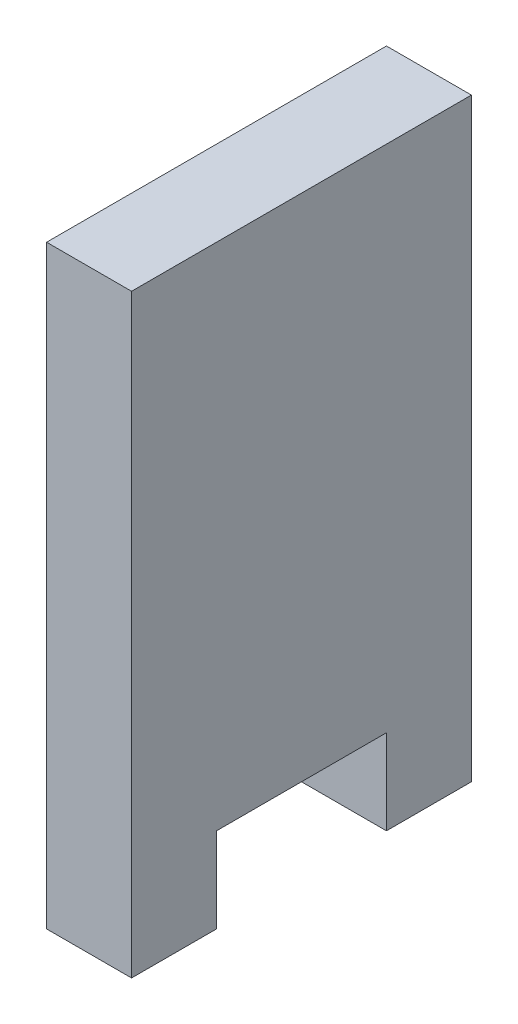
ISO-10303-21;
HEADER;
FILE_DESCRIPTION(('STEP AP214'),'2;1');
FILE_NAME('part.step','',(''),(''),'','','');
FILE_SCHEMA(('AUTOMOTIVE_DESIGN { 1 0 10303 214 1 1 1 1 }'));
ENDSEC;
DATA;
#1=APPLICATION_CONTEXT('core data for automotive mechanical design processes');
#2=APPLICATION_PROTOCOL_DEFINITION('international standard','automotive_design',2000,#1);
#3=PRODUCT_CONTEXT('',#1,'mechanical');
#4=PRODUCT('Part','Part','',(#3));
#5=PRODUCT_RELATED_PRODUCT_CATEGORY('part','',(#4));
#6=PRODUCT_DEFINITION_FORMATION('','',#4);
#7=PRODUCT_DEFINITION_CONTEXT('part definition',#1,'design');
#8=PRODUCT_DEFINITION('design','',#6,#7);
#9=PRODUCT_DEFINITION_SHAPE('','',#8);
#10=(LENGTH_UNIT() NAMED_UNIT(*) SI_UNIT(.MILLI.,.METRE.));
#11=(NAMED_UNIT(*) PLANE_ANGLE_UNIT() SI_UNIT($,.RADIAN.));
#12=(NAMED_UNIT(*) SI_UNIT($,.STERADIAN.) SOLID_ANGLE_UNIT());
#13=UNCERTAINTY_MEASURE_WITH_UNIT(LENGTH_MEASURE(1.E-05),#10,'distance_accuracy_value','');
#14=(GEOMETRIC_REPRESENTATION_CONTEXT(3) GLOBAL_UNCERTAINTY_ASSIGNED_CONTEXT((#13)) GLOBAL_UNIT_ASSIGNED_CONTEXT((#10,
#11,#12)) REPRESENTATION_CONTEXT('',''));
#15=CARTESIAN_POINT('',(0.,0.,0.));
#16=DIRECTION('',(0.,0.,1.));
#17=DIRECTION('',(1.,0.,0.));
#18=AXIS2_PLACEMENT_3D('',#15,#16,#17);
#19=CARTESIAN_POINT('',(6.35,-19.05,0.));
#20=DIRECTION('',(0.,1.,0.));
#21=DIRECTION('',(0.,0.,1.));
#22=AXIS2_PLACEMENT_3D('',#19,#20,#21);
#23=PLANE('',#22);
#24=DIRECTION('',(0.,0.,-1.));
#25=VECTOR('',#24,1.);
#26=CARTESIAN_POINT('',(0.,-19.05,0.));
#27=LINE('',#26,#25);
#28=CARTESIAN_POINT('',(0.,-19.05,6.35));
#29=VERTEX_POINT('',#28);
#30=CARTESIAN_POINT('',(0.,-19.05,-6.35));
#31=VERTEX_POINT('',#30);
#32=EDGE_CURVE('E133',#29,#31,#27,.T.);
#33=ORIENTED_EDGE('',*,*,#32,.T.);
#34=DIRECTION('',(-1.,0.,0.));
#35=VECTOR('',#34,1.);
#36=CARTESIAN_POINT('',(6.35,-19.05,-6.35));
#37=LINE('',#36,#35);
#38=CARTESIAN_POINT('',(6.35,-19.05,-6.35));
#39=VERTEX_POINT('',#38);
#40=EDGE_CURVE('E11',#39,#31,#37,.T.);
#41=ORIENTED_EDGE('',*,*,#40,.F.);
#42=DIRECTION('',(0.,0.,-1.));
#43=VECTOR('',#42,1.);
#44=CARTESIAN_POINT('',(6.35,-19.05,0.));
#45=LINE('',#44,#43);
#46=CARTESIAN_POINT('',(6.35,-19.05,6.35));
#47=VERTEX_POINT('',#46);
#48=EDGE_CURVE('E153',#47,#39,#45,.T.);
#49=ORIENTED_EDGE('',*,*,#48,.F.);
#50=DIRECTION('',(-1.,0.,0.));
#51=VECTOR('',#50,1.);
#52=CARTESIAN_POINT('',(6.35,-19.05,6.35));
#53=LINE('',#52,#51);
#54=EDGE_CURVE('E51',#47,#29,#53,.T.);
#55=ORIENTED_EDGE('',*,*,#54,.T.);
#56=EDGE_LOOP('',(#33,#41,#49,#55));
#57=FACE_BOUND('',#56,.T.);
#58=ADVANCED_FACE('F35',(#57),#23,.F.);
#59=CARTESIAN_POINT('',(6.35,0.,-6.35));
#60=DIRECTION('',(0.,0.,-1.));
#61=DIRECTION('',(0.,1.,0.));
#62=AXIS2_PLACEMENT_3D('',#59,#60,#61);
#63=PLANE('',#62);
#64=DIRECTION('',(0.,-1.,0.));
#65=VECTOR('',#64,1.);
#66=CARTESIAN_POINT('',(0.,0.,-6.35));
#67=LINE('',#66,#65);
#68=CARTESIAN_POINT('',(0.,-25.4,-6.35));
#69=VERTEX_POINT('',#68);
#70=EDGE_CURVE('E135',#31,#69,#67,.T.);
#71=ORIENTED_EDGE('',*,*,#70,.T.);
#72=DIRECTION('',(-1.,0.,0.));
#73=VECTOR('',#72,1.);
#74=CARTESIAN_POINT('',(6.35,-25.4,-6.35));
#75=LINE('',#74,#73);
#76=CARTESIAN_POINT('',(6.35,-25.4,-6.35));
#77=VERTEX_POINT('',#76);
#78=EDGE_CURVE('E43',#77,#69,#75,.T.);
#79=ORIENTED_EDGE('',*,*,#78,.F.);
#80=DIRECTION('',(0.,-1.,0.));
#81=VECTOR('',#80,1.);
#82=CARTESIAN_POINT('',(6.35,0.,-6.35));
#83=LINE('',#82,#81);
#84=EDGE_CURVE('E90',#39,#77,#83,.T.);
#85=ORIENTED_EDGE('',*,*,#84,.F.);
#86=ORIENTED_EDGE('',*,*,#40,.T.);
#87=EDGE_LOOP('',(#71,#79,#85,#86));
#88=FACE_BOUND('',#87,.T.);
#89=ADVANCED_FACE('F166',(#88),#63,.F.);
#90=CARTESIAN_POINT('',(6.35,-25.4,0.));
#91=DIRECTION('',(0.,-1.,0.));
#92=DIRECTION('',(0.,0.,-1.));
#93=AXIS2_PLACEMENT_3D('',#90,#91,#92);
#94=PLANE('',#93);
#95=DIRECTION('',(0.,0.,1.));
#96=VECTOR('',#95,1.);
#97=CARTESIAN_POINT('',(0.,-25.4,0.));
#98=LINE('',#97,#96);
#99=CARTESIAN_POINT('',(0.,-25.4,-12.7));
#100=VERTEX_POINT('',#99);
#101=EDGE_CURVE('E138',#100,#69,#98,.T.);
#102=ORIENTED_EDGE('',*,*,#101,.F.);
#103=DIRECTION('',(-1.,0.,0.));
#104=VECTOR('',#103,1.);
#105=CARTESIAN_POINT('',(6.35,-25.4,-12.7));
#106=LINE('',#105,#104);
#107=CARTESIAN_POINT('',(6.35,-25.4,-12.7));
#108=VERTEX_POINT('',#107);
#109=EDGE_CURVE('E159',#108,#100,#106,.T.);
#110=ORIENTED_EDGE('',*,*,#109,.F.);
#111=DIRECTION('',(0.,0.,1.));
#112=VECTOR('',#111,1.);
#113=CARTESIAN_POINT('',(6.35,-25.4,0.));
#114=LINE('',#113,#112);
#115=EDGE_CURVE('E165',#108,#77,#114,.T.);
#116=ORIENTED_EDGE('',*,*,#115,.T.);
#117=ORIENTED_EDGE('',*,*,#78,.T.);
#118=EDGE_LOOP('',(#102,#110,#116,#117));
#119=FACE_BOUND('',#118,.T.);
#120=ADVANCED_FACE('F163',(#119),#94,.T.);
#121=CARTESIAN_POINT('',(6.35,0.,-12.7));
#122=DIRECTION('',(0.,0.,1.));
#123=DIRECTION('',(0.,-1.,0.));
#124=AXIS2_PLACEMENT_3D('',#121,#122,#123);
#125=PLANE('',#124);
#126=DIRECTION('',(0.,1.,0.));
#127=VECTOR('',#126,1.);
#128=CARTESIAN_POINT('',(0.,0.,-12.7));
#129=LINE('',#128,#127);
#130=CARTESIAN_POINT('',(0.,19.05,-12.7));
#131=VERTEX_POINT('',#130);
#132=EDGE_CURVE('E141',#100,#131,#129,.T.);
#133=ORIENTED_EDGE('',*,*,#132,.T.);
#134=DIRECTION('',(-1.,0.,0.));
#135=VECTOR('',#134,1.);
#136=CARTESIAN_POINT('',(6.35,19.05,-12.7));
#137=LINE('',#136,#135);
#138=CARTESIAN_POINT('',(6.35,19.05,-12.7));
#139=VERTEX_POINT('',#138);
#140=EDGE_CURVE('E157',#139,#131,#137,.T.);
#141=ORIENTED_EDGE('',*,*,#140,.F.);
#142=DIRECTION('',(0.,1.,0.));
#143=VECTOR('',#142,1.);
#144=CARTESIAN_POINT('',(6.35,0.,-12.7));
#145=LINE('',#144,#143);
#146=EDGE_CURVE('E128',#108,#139,#145,.T.);
#147=ORIENTED_EDGE('',*,*,#146,.F.);
#148=ORIENTED_EDGE('',*,*,#109,.T.);
#149=EDGE_LOOP('',(#133,#141,#147,#148));
#150=FACE_BOUND('',#149,.T.);
#151=ADVANCED_FACE('F174',(#150),#125,.F.);
#152=CARTESIAN_POINT('',(6.35,19.05,0.));
#153=DIRECTION('',(0.,1.,0.));
#154=DIRECTION('',(0.,0.,1.));
#155=AXIS2_PLACEMENT_3D('',#152,#153,#154);
#156=PLANE('',#155);
#157=DIRECTION('',(0.,0.,-1.));
#158=VECTOR('',#157,1.);
#159=CARTESIAN_POINT('',(0.,19.05,0.));
#160=LINE('',#159,#158);
#161=CARTESIAN_POINT('',(0.,19.05,12.7));
#162=VERTEX_POINT('',#161);
#163=EDGE_CURVE('E144',#162,#131,#160,.T.);
#164=ORIENTED_EDGE('',*,*,#163,.F.);
#165=DIRECTION('',(-1.,0.,0.));
#166=VECTOR('',#165,1.);
#167=CARTESIAN_POINT('',(6.35,19.05,12.7));
#168=LINE('',#167,#166);
#169=CARTESIAN_POINT('',(6.35,19.05,12.7));
#170=VERTEX_POINT('',#169);
#171=EDGE_CURVE('E115',#170,#162,#168,.T.);
#172=ORIENTED_EDGE('',*,*,#171,.F.);
#173=DIRECTION('',(0.,0.,-1.));
#174=VECTOR('',#173,1.);
#175=CARTESIAN_POINT('',(6.35,19.05,0.));
#176=LINE('',#175,#174);
#177=EDGE_CURVE('E126',#170,#139,#176,.T.);
#178=ORIENTED_EDGE('',*,*,#177,.T.);
#179=ORIENTED_EDGE('',*,*,#140,.T.);
#180=EDGE_LOOP('',(#164,#172,#178,#179));
#181=FACE_BOUND('',#180,.T.);
#182=ADVANCED_FACE('F200',(#181),#156,.T.);
#183=CARTESIAN_POINT('',(6.35,0.,12.7));
#184=DIRECTION('',(0.,0.,1.));
#185=DIRECTION('',(0.,-1.,0.));
#186=AXIS2_PLACEMENT_3D('',#183,#184,#185);
#187=PLANE('',#186);
#188=DIRECTION('',(0.,1.,0.));
#189=VECTOR('',#188,1.);
#190=CARTESIAN_POINT('',(0.,0.,12.7));
#191=LINE('',#190,#189);
#192=CARTESIAN_POINT('',(0.,-25.4,12.7));
#193=VERTEX_POINT('',#192);
#194=EDGE_CURVE('E112',#193,#162,#191,.T.);
#195=ORIENTED_EDGE('',*,*,#194,.F.);
#196=DIRECTION('',(-1.,0.,0.));
#197=VECTOR('',#196,1.);
#198=CARTESIAN_POINT('',(6.35,-25.4,12.7));
#199=LINE('',#198,#197);
#200=CARTESIAN_POINT('',(6.35,-25.4,12.7));
#201=VERTEX_POINT('',#200);
#202=EDGE_CURVE('E106',#201,#193,#199,.T.);
#203=ORIENTED_EDGE('',*,*,#202,.F.);
#204=DIRECTION('',(0.,1.,0.));
#205=VECTOR('',#204,1.);
#206=CARTESIAN_POINT('',(6.35,0.,12.7));
#207=LINE('',#206,#205);
#208=EDGE_CURVE('E110',#201,#170,#207,.T.);
#209=ORIENTED_EDGE('',*,*,#208,.T.);
#210=ORIENTED_EDGE('',*,*,#171,.T.);
#211=EDGE_LOOP('',(#195,#203,#209,#210));
#212=FACE_BOUND('',#211,.T.);
#213=ADVANCED_FACE('F108',(#212),#187,.T.);
#214=CARTESIAN_POINT('',(6.35,-25.4,0.));
#215=DIRECTION('',(0.,1.,0.));
#216=DIRECTION('',(0.,0.,1.));
#217=AXIS2_PLACEMENT_3D('',#214,#215,#216);
#218=PLANE('',#217);
#219=DIRECTION('',(0.,0.,-1.));
#220=VECTOR('',#219,1.);
#221=CARTESIAN_POINT('',(0.,-25.4,0.));
#222=LINE('',#221,#220);
#223=CARTESIAN_POINT('',(0.,-25.4,6.35));
#224=VERTEX_POINT('',#223);
#225=EDGE_CURVE('E148',#193,#224,#222,.T.);
#226=ORIENTED_EDGE('',*,*,#225,.T.);
#227=DIRECTION('',(-1.,0.,0.));
#228=VECTOR('',#227,1.);
#229=CARTESIAN_POINT('',(6.35,-25.4,6.35));
#230=LINE('',#229,#228);
#231=CARTESIAN_POINT('',(6.35,-25.4,6.35));
#232=VERTEX_POINT('',#231);
#233=EDGE_CURVE('E78',#232,#224,#230,.T.);
#234=ORIENTED_EDGE('',*,*,#233,.F.);
#235=DIRECTION('',(0.,0.,-1.));
#236=VECTOR('',#235,1.);
#237=CARTESIAN_POINT('',(6.35,-25.4,0.));
#238=LINE('',#237,#236);
#239=EDGE_CURVE('E117',#201,#232,#238,.T.);
#240=ORIENTED_EDGE('',*,*,#239,.F.);
#241=ORIENTED_EDGE('',*,*,#202,.T.);
#242=EDGE_LOOP('',(#226,#234,#240,#241));
#243=FACE_BOUND('',#242,.T.);
#244=ADVANCED_FACE('F118',(#243),#218,.F.);
#245=CARTESIAN_POINT('',(6.35,0.,6.35));
#246=DIRECTION('',(0.,0.,-1.));
#247=DIRECTION('',(-1.,0.,0.));
#248=AXIS2_PLACEMENT_3D('',#245,#246,#247);
#249=PLANE('',#248);
#250=DIRECTION('',(0.,-1.,0.));
#251=VECTOR('',#250,1.);
#252=CARTESIAN_POINT('',(0.,0.,6.35));
#253=LINE('',#252,#251);
#254=EDGE_CURVE('E150',#29,#224,#253,.T.);
#255=ORIENTED_EDGE('',*,*,#254,.F.);
#256=ORIENTED_EDGE('',*,*,#54,.F.);
#257=DIRECTION('',(0.,-1.,0.));
#258=VECTOR('',#257,1.);
#259=CARTESIAN_POINT('',(6.35,0.,6.35));
#260=LINE('',#259,#258);
#261=EDGE_CURVE('E121',#47,#232,#260,.T.);
#262=ORIENTED_EDGE('',*,*,#261,.T.);
#263=ORIENTED_EDGE('',*,*,#233,.T.);
#264=EDGE_LOOP('',(#255,#256,#262,#263));
#265=FACE_BOUND('',#264,.T.);
#266=ADVANCED_FACE('F179',(#265),#249,.T.);
#267=CARTESIAN_POINT('',(6.35,0.,0.));
#268=DIRECTION('',(1.,0.,0.));
#269=DIRECTION('',(0.,0.,-1.));
#270=AXIS2_PLACEMENT_3D('',#267,#268,#269);
#271=PLANE('',#270);
#272=ORIENTED_EDGE('',*,*,#48,.T.);
#273=ORIENTED_EDGE('',*,*,#84,.T.);
#274=ORIENTED_EDGE('',*,*,#115,.F.);
#275=ORIENTED_EDGE('',*,*,#146,.T.);
#276=ORIENTED_EDGE('',*,*,#177,.F.);
#277=ORIENTED_EDGE('',*,*,#208,.F.);
#278=ORIENTED_EDGE('',*,*,#239,.T.);
#279=ORIENTED_EDGE('',*,*,#261,.F.);
#280=EDGE_LOOP('',(#272,#273,#274,#275,#276,#277,#278,#279));
#281=FACE_BOUND('',#280,.T.);
#282=ADVANCED_FACE('F124',(#281),#271,.T.);
#283=CARTESIAN_POINT('',(0.,0.,0.));
#284=DIRECTION('',(1.,0.,0.));
#285=DIRECTION('',(0.,0.,-1.));
#286=AXIS2_PLACEMENT_3D('',#283,#284,#285);
#287=PLANE('',#286);
#288=ORIENTED_EDGE('',*,*,#32,.F.);
#289=ORIENTED_EDGE('',*,*,#254,.T.);
#290=ORIENTED_EDGE('',*,*,#225,.F.);
#291=ORIENTED_EDGE('',*,*,#194,.T.);
#292=ORIENTED_EDGE('',*,*,#163,.T.);
#293=ORIENTED_EDGE('',*,*,#132,.F.);
#294=ORIENTED_EDGE('',*,*,#101,.T.);
#295=ORIENTED_EDGE('',*,*,#70,.F.);
#296=EDGE_LOOP('',(#288,#289,#290,#291,#292,#293,#294,#295));
#297=FACE_BOUND('',#296,.T.);
#298=ADVANCED_FACE('F170',(#297),#287,.F.);
#299=CLOSED_SHELL('',(#58,#89,#120,#151,#182,#213,#244,#266,#282,#298));
#300=MANIFOLD_SOLID_BREP('B2',#299);
#301=ADVANCED_BREP_SHAPE_REPRESENTATION('',(#18,#300),#14);
#302=SHAPE_DEFINITION_REPRESENTATION(#9,#301);
ENDSEC;
END-ISO-10303-21;
